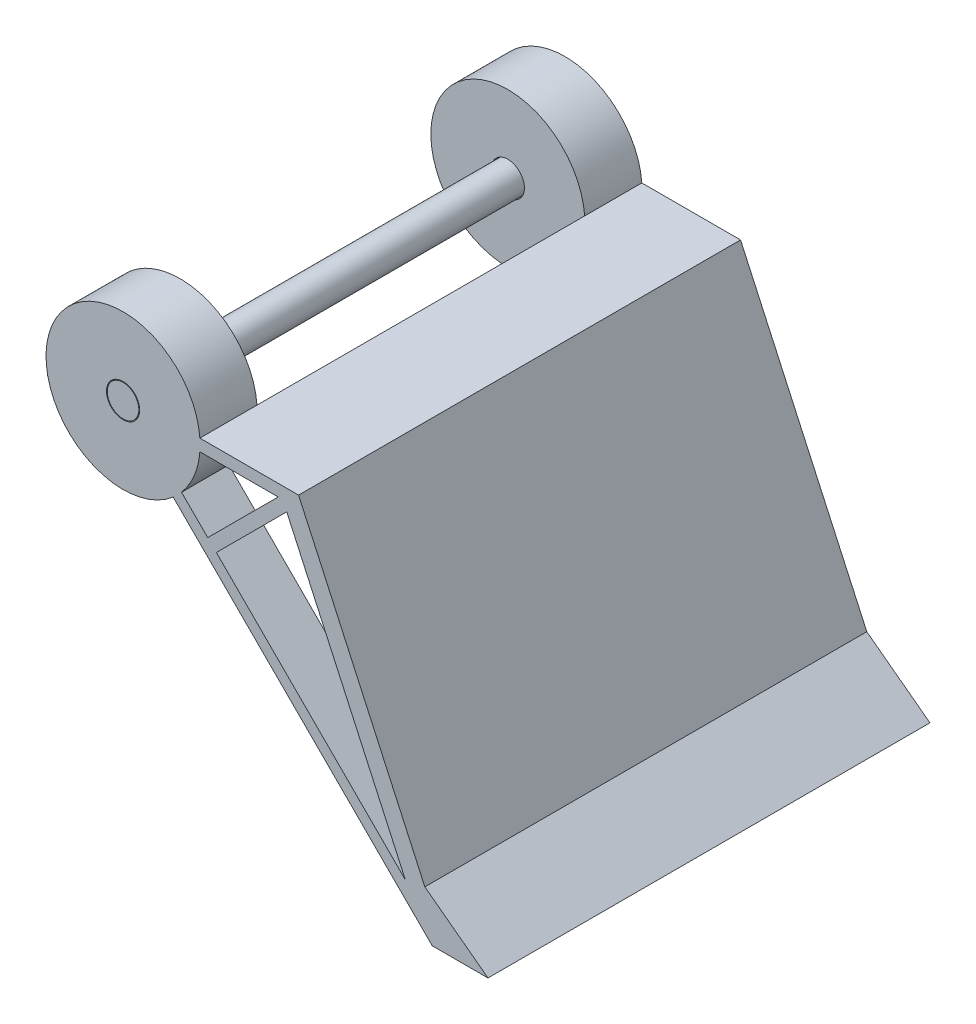
ISO-10303-21;
HEADER;
FILE_DESCRIPTION(('STEP AP214'),'2;1');
FILE_NAME('part.step','',(''),(''),'','','');
FILE_SCHEMA(('AUTOMOTIVE_DESIGN { 1 0 10303 214 1 1 1 1 }'));
ENDSEC;
DATA;
#1=APPLICATION_CONTEXT('core data for automotive mechanical design processes');
#2=APPLICATION_PROTOCOL_DEFINITION('international standard','automotive_design',2000,#1);
#3=PRODUCT_CONTEXT('',#1,'mechanical');
#4=PRODUCT('Part','Part','',(#3));
#5=PRODUCT_RELATED_PRODUCT_CATEGORY('part','',(#4));
#6=PRODUCT_DEFINITION_FORMATION('','',#4);
#7=PRODUCT_DEFINITION_CONTEXT('part definition',#1,'design');
#8=PRODUCT_DEFINITION('design','',#6,#7);
#9=PRODUCT_DEFINITION_SHAPE('','',#8);
#10=(LENGTH_UNIT() NAMED_UNIT(*) SI_UNIT(.MILLI.,.METRE.));
#11=(NAMED_UNIT(*) PLANE_ANGLE_UNIT() SI_UNIT($,.RADIAN.));
#12=(NAMED_UNIT(*) SI_UNIT($,.STERADIAN.) SOLID_ANGLE_UNIT());
#13=UNCERTAINTY_MEASURE_WITH_UNIT(LENGTH_MEASURE(1.E-05),#10,'distance_accuracy_value','');
#14=(GEOMETRIC_REPRESENTATION_CONTEXT(3) GLOBAL_UNCERTAINTY_ASSIGNED_CONTEXT((#13)) GLOBAL_UNIT_ASSIGNED_CONTEXT((#10,
#11,#12)) REPRESENTATION_CONTEXT('',''));
#15=CARTESIAN_POINT('',(0.,0.,0.));
#16=DIRECTION('',(0.,0.,1.));
#17=DIRECTION('',(1.,0.,0.));
#18=AXIS2_PLACEMENT_3D('',#15,#16,#17);
#19=CARTESIAN_POINT('',(0.,0.,0.));
#20=DIRECTION('',(0.,0.,1.));
#21=DIRECTION('',(1.,0.,0.));
#22=AXIS2_PLACEMENT_3D('',#19,#20,#21);
#23=CYLINDRICAL_SURFACE('',#22,12.7);
#24=CARTESIAN_POINT('',(0.,0.,0.));
#25=DIRECTION('',(0.,0.,-1.));
#26=DIRECTION('',(-1.,0.,0.));
#27=AXIS2_PLACEMENT_3D('',#24,#25,#26);
#28=CIRCLE('',#27,12.7);
#29=CARTESIAN_POINT('',(-12.7,0.,0.));
#30=VERTEX_POINT('',#29);
#31=EDGE_CURVE('E11',#30,#30,#28,.T.);
#32=ORIENTED_EDGE('',*,*,#31,.F.);
#33=EDGE_LOOP('',(#32));
#34=FACE_BOUND('',#33,.T.);
#35=CARTESIAN_POINT('',(0.,0.,355.6));
#36=DIRECTION('',(0.,0.,-1.));
#37=DIRECTION('',(-1.,0.,0.));
#38=AXIS2_PLACEMENT_3D('',#35,#36,#37);
#39=CIRCLE('',#38,12.7);
#40=CARTESIAN_POINT('',(-12.7,0.,355.6));
#41=VERTEX_POINT('',#40);
#42=EDGE_CURVE('E54',#41,#41,#39,.T.);
#43=ORIENTED_EDGE('',*,*,#42,.T.);
#44=EDGE_LOOP('',(#43));
#45=FACE_BOUND('',#44,.T.);
#46=ADVANCED_FACE('F51',(#34,#45),#23,.T.);
#47=CARTESIAN_POINT('',(0.,0.,0.));
#48=DIRECTION('',(0.,0.,-1.));
#49=DIRECTION('',(-1.,0.,0.));
#50=AXIS2_PLACEMENT_3D('',#47,#48,#49);
#51=PLANE('',#50);
#52=ORIENTED_EDGE('',*,*,#31,.T.);
#53=EDGE_LOOP('',(#52));
#54=FACE_BOUND('',#53,.T.);
#55=ADVANCED_FACE('F66',(#54),#51,.T.);
#56=CARTESIAN_POINT('',(0.,0.,355.6));
#57=DIRECTION('',(0.,0.,-1.));
#58=DIRECTION('',(-1.,0.,0.));
#59=AXIS2_PLACEMENT_3D('',#56,#57,#58);
#60=PLANE('',#59);
#61=ORIENTED_EDGE('',*,*,#42,.F.);
#62=EDGE_LOOP('',(#61));
#63=FACE_BOUND('',#62,.T.);
#64=ADVANCED_FACE('F64',(#63),#60,.F.);
#65=CLOSED_SHELL('',(#46,#55,#64));
#66=MANIFOLD_SOLID_BREP('B2',#65);
#67=CARTESIAN_POINT('',(40.3264720288239,-47.0616641196259,355.6));
#68=DIRECTION('',(0.707106781186547,0.707106781186547,0.));
#69=DIRECTION('',(-0.707106781186548,0.707106781186548,0.));
#70=AXIS2_PLACEMENT_3D('',#67,#68,#69);
#71=PLANE('',#70);
#72=DIRECTION('',(-0.707106781186548,0.707106781186548,0.));
#73=VECTOR('',#72,1.);
#74=CARTESIAN_POINT('',(40.3264720288239,-47.0616641196259,317.5));
#75=LINE('',#74,#73);
#76=CARTESIAN_POINT('',(248.788807909198,-255.524,317.5));
#77=VERTEX_POINT('',#76);
#78=CARTESIAN_POINT('',(40.3264720288239,-47.0616641196259,317.5));
#79=VERTEX_POINT('',#78);
#80=EDGE_CURVE('E260',#77,#79,#75,.T.);
#81=ORIENTED_EDGE('',*,*,#80,.F.);
#82=DIRECTION('',(0.,0.,-1.));
#83=VECTOR('',#82,1.);
#84=CARTESIAN_POINT('',(248.788807909198,-255.524,355.6));
#85=LINE('',#84,#83);
#86=CARTESIAN_POINT('',(248.788807909198,-255.524,355.6));
#87=VERTEX_POINT('',#86);
#88=EDGE_CURVE('E288',#87,#77,#85,.T.);
#89=ORIENTED_EDGE('',*,*,#88,.F.);
#90=DIRECTION('',(0.707106781186548,-0.707106781186547,0.));
#91=VECTOR('',#90,1.);
#92=CARTESIAN_POINT('',(40.3264720288239,-47.0616641196259,355.6));
#93=LINE('',#92,#91);
#94=CARTESIAN_POINT('',(40.3264720288239,-47.0616641196259,355.6));
#95=VERTEX_POINT('',#94);
#96=EDGE_CURVE('E286',#95,#87,#93,.T.);
#97=ORIENTED_EDGE('',*,*,#96,.F.);
#98=DIRECTION('',(0.,0.,-1.));
#99=VECTOR('',#98,1.);
#100=CARTESIAN_POINT('',(40.3264720288239,-47.0616641196259,355.6));
#101=LINE('',#100,#99);
#102=EDGE_CURVE('E49',#95,#79,#101,.T.);
#103=ORIENTED_EDGE('',*,*,#102,.T.);
#104=EDGE_LOOP('',(#81,#89,#97,#103));
#105=FACE_BOUND('',#104,.T.);
#106=ADVANCED_FACE('F98',(#105),#71,.F.);
#107=CARTESIAN_POINT('',(75.0520862114414,-68.3168941206397,355.6));
#108=DIRECTION('',(0.707106781186547,0.707106781186548,0.));
#109=DIRECTION('',(-0.707106781186548,0.707106781186547,0.));
#110=AXIS2_PLACEMENT_3D('',#107,#108,#109);
#111=PLANE('',#110);
#112=DIRECTION('',(0.,0.,-1.));
#113=VECTOR('',#112,1.);
#114=CARTESIAN_POINT('',(227.154568258756,-220.419376167954,355.6));
#115=LINE('',#114,#113);
#116=CARTESIAN_POINT('',(227.154568258756,-220.419376167954,355.6));
#117=VERTEX_POINT('',#116);
#118=CARTESIAN_POINT('',(227.154568258756,-220.419376167954,317.5));
#119=VERTEX_POINT('',#118);
#120=EDGE_CURVE('E309',#117,#119,#115,.T.);
#121=ORIENTED_EDGE('',*,*,#120,.T.);
#122=DIRECTION('',(-0.707106781186548,0.707106781186547,0.));
#123=VECTOR('',#122,1.);
#124=CARTESIAN_POINT('',(75.0520862114414,-68.3168941206397,317.5));
#125=LINE('',#124,#123);
#126=CARTESIAN_POINT('',(75.0520862114414,-68.3168941206397,317.5));
#127=VERTEX_POINT('',#126);
#128=EDGE_CURVE('E272',#119,#127,#125,.T.);
#129=ORIENTED_EDGE('',*,*,#128,.T.);
#130=DIRECTION('',(0.,0.,-1.));
#131=VECTOR('',#130,1.);
#132=CARTESIAN_POINT('',(75.0520862114414,-68.3168941206397,355.6));
#133=LINE('',#132,#131);
#134=CARTESIAN_POINT('',(75.0520862114414,-68.3168941206397,355.6));
#135=VERTEX_POINT('',#134);
#136=EDGE_CURVE('E496',#135,#127,#133,.T.);
#137=ORIENTED_EDGE('',*,*,#136,.F.);
#138=DIRECTION('',(0.707106781186548,-0.707106781186547,0.));
#139=VECTOR('',#138,1.);
#140=CARTESIAN_POINT('',(75.0520862114414,-68.3168941206397,355.6));
#141=LINE('',#140,#139);
#142=EDGE_CURVE('E474',#135,#117,#141,.T.);
#143=ORIENTED_EDGE('',*,*,#142,.T.);
#144=EDGE_LOOP('',(#121,#129,#137,#143));
#145=FACE_BOUND('',#144,.T.);
#146=ADVANCED_FACE('F578',(#145),#111,.T.);
#147=CARTESIAN_POINT('',(227.154568258756,-220.419376167954,355.6));
#148=DIRECTION('',(-0.909429543006509,-0.415858036241902,0.));
#149=DIRECTION('',(0.415858036241902,-0.909429543006509,0.));
#150=AXIS2_PLACEMENT_3D('',#147,#148,#149);
#151=PLANE('',#150);
#152=DIRECTION('',(0.,0.,-1.));
#153=VECTOR('',#152,1.);
#154=CARTESIAN_POINT('',(131.698999999998,-11.6699803320833,355.6));
#155=LINE('',#154,#153);
#156=CARTESIAN_POINT('',(131.698999999998,-11.6699803320833,355.6));
#157=VERTEX_POINT('',#156);
#158=CARTESIAN_POINT('',(131.698999999998,-11.6699803320833,317.5));
#159=VERTEX_POINT('',#158);
#160=EDGE_CURVE('E500',#157,#159,#155,.T.);
#161=ORIENTED_EDGE('',*,*,#160,.T.);
#162=DIRECTION('',(0.415858036241902,-0.909429543006509,0.));
#163=VECTOR('',#162,1.);
#164=CARTESIAN_POINT('',(227.154568258756,-220.419376167954,317.5));
#165=LINE('',#164,#163);
#166=EDGE_CURVE('E122',#159,#119,#165,.T.);
#167=ORIENTED_EDGE('',*,*,#166,.T.);
#168=ORIENTED_EDGE('',*,*,#120,.F.);
#169=DIRECTION('',(-0.415858036241902,0.909429543006509,0.));
#170=VECTOR('',#169,1.);
#171=CARTESIAN_POINT('',(227.154568258756,-220.419376167954,355.6));
#172=LINE('',#171,#170);
#173=EDGE_CURVE('E477',#117,#157,#172,.T.);
#174=ORIENTED_EDGE('',*,*,#173,.T.);
#175=EDGE_LOOP('',(#161,#167,#168,#174));
#176=FACE_BOUND('',#175,.T.);
#177=ADVANCED_FACE('F582',(#176),#151,.T.);
#178=CARTESIAN_POINT('',(75.0520862114414,-68.3168941206397,355.6));
#179=DIRECTION('',(0.707106781186547,-0.707106781186548,0.));
#180=DIRECTION('',(0.707106781186548,0.707106781186547,0.));
#181=AXIS2_PLACEMENT_3D('',#178,#179,#180);
#182=PLANE('',#181);
#183=ORIENTED_EDGE('',*,*,#136,.T.);
#184=DIRECTION('',(0.707106781186548,0.707106781186547,0.));
#185=VECTOR('',#184,1.);
#186=CARTESIAN_POINT('',(75.0520862114414,-68.3168941206397,317.5));
#187=LINE('',#186,#185);
#188=EDGE_CURVE('E539',#127,#159,#187,.T.);
#189=ORIENTED_EDGE('',*,*,#188,.T.);
#190=ORIENTED_EDGE('',*,*,#160,.F.);
#191=DIRECTION('',(-0.707106781186548,-0.707106781186547,0.));
#192=VECTOR('',#191,1.);
#193=CARTESIAN_POINT('',(75.0520862114414,-68.3168941206397,355.6));
#194=LINE('',#193,#192);
#195=EDGE_CURVE('E482',#157,#135,#194,.T.);
#196=ORIENTED_EDGE('',*,*,#195,.T.);
#197=EDGE_LOOP('',(#183,#189,#190,#196));
#198=FACE_BOUND('',#197,.T.);
#199=ADVANCED_FACE('F606',(#198),#182,.T.);
#200=CARTESIAN_POINT('',(47.0616641196258,-40.326472028824,355.6));
#201=DIRECTION('',(0.707106781186548,0.707106781186547,0.));
#202=DIRECTION('',(-0.707106781186547,0.707106781186548,0.));
#203=AXIS2_PLACEMENT_3D('',#200,#201,#202);
#204=PLANE('',#203);
#205=DIRECTION('',(0.,0.,-1.));
#206=VECTOR('',#205,1.);
#207=CARTESIAN_POINT('',(68.1446058793603,-61.4094137885586,355.6));
#208=LINE('',#207,#206);
#209=CARTESIAN_POINT('',(68.1446058793603,-61.4094137885586,355.6));
#210=VERTEX_POINT('',#209);
#211=CARTESIAN_POINT('',(68.1446058793603,-61.4094137885586,317.5));
#212=VERTEX_POINT('',#211);
#213=EDGE_CURVE('E458',#210,#212,#208,.T.);
#214=ORIENTED_EDGE('',*,*,#213,.T.);
#215=DIRECTION('',(-0.707106781186547,0.707106781186548,0.));
#216=VECTOR('',#215,1.);
#217=CARTESIAN_POINT('',(47.0616641196258,-40.326472028824,317.5));
#218=LINE('',#217,#216);
#219=CARTESIAN_POINT('',(47.0616641196258,-40.326472028824,317.5));
#220=VERTEX_POINT('',#219);
#221=EDGE_CURVE('E536',#212,#220,#218,.T.);
#222=ORIENTED_EDGE('',*,*,#221,.T.);
#223=DIRECTION('',(0.,0.,-1.));
#224=VECTOR('',#223,1.);
#225=CARTESIAN_POINT('',(47.0616641196258,-40.326472028824,355.6));
#226=LINE('',#225,#224);
#227=CARTESIAN_POINT('',(47.0616641196258,-40.326472028824,355.6));
#228=VERTEX_POINT('',#227);
#229=EDGE_CURVE('E281',#228,#220,#226,.T.);
#230=ORIENTED_EDGE('',*,*,#229,.F.);
#231=DIRECTION('',(0.707106781186547,-0.707106781186548,0.));
#232=VECTOR('',#231,1.);
#233=CARTESIAN_POINT('',(47.0616641196258,-40.326472028824,355.6));
#234=LINE('',#233,#232);
#235=EDGE_CURVE('E426',#228,#210,#234,.T.);
#236=ORIENTED_EDGE('',*,*,#235,.T.);
#237=EDGE_LOOP('',(#214,#222,#230,#236));
#238=FACE_BOUND('',#237,.T.);
#239=ADVANCED_FACE('F614',(#238),#204,.T.);
#240=CARTESIAN_POINT('',(124.791519667919,-4.7625,355.6));
#241=DIRECTION('',(-0.707106781186547,0.707106781186547,0.));
#242=DIRECTION('',(-0.707106781186548,-0.707106781186548,0.));
#243=AXIS2_PLACEMENT_3D('',#240,#241,#242);
#244=PLANE('',#243);
#245=DIRECTION('',(0.,0.,-1.));
#246=VECTOR('',#245,1.);
#247=CARTESIAN_POINT('',(124.791519667919,-4.7625,355.6));
#248=LINE('',#247,#246);
#249=CARTESIAN_POINT('',(124.791519667919,-4.7625,355.6));
#250=VERTEX_POINT('',#249);
#251=CARTESIAN_POINT('',(124.791519667919,-4.7625,317.5));
#252=VERTEX_POINT('',#251);
#253=EDGE_CURVE('E453',#250,#252,#248,.T.);
#254=ORIENTED_EDGE('',*,*,#253,.T.);
#255=DIRECTION('',(-0.707106781186548,-0.707106781186548,0.));
#256=VECTOR('',#255,1.);
#257=CARTESIAN_POINT('',(124.791519667919,-4.7625,317.5));
#258=LINE('',#257,#256);
#259=EDGE_CURVE('E527',#252,#212,#258,.T.);
#260=ORIENTED_EDGE('',*,*,#259,.T.);
#261=ORIENTED_EDGE('',*,*,#213,.F.);
#262=DIRECTION('',(0.707106781186547,0.707106781186547,0.));
#263=VECTOR('',#262,1.);
#264=CARTESIAN_POINT('',(124.791519667919,-4.7625,355.6));
#265=LINE('',#264,#263);
#266=EDGE_CURVE('E430',#210,#250,#265,.T.);
#267=ORIENTED_EDGE('',*,*,#266,.T.);
#268=EDGE_LOOP('',(#254,#260,#261,#267));
#269=FACE_BOUND('',#268,.T.);
#270=ADVANCED_FACE('F619',(#269),#244,.T.);
#271=CARTESIAN_POINT('',(0.,0.,355.6));
#272=DIRECTION('',(0.,0.,-1.));
#273=DIRECTION('',(-1.,0.,0.));
#274=AXIS2_PLACEMENT_3D('',#271,#272,#273);
#275=CYLINDRICAL_SURFACE('',#274,13.335);
#276=CARTESIAN_POINT('',(0.,0.,355.6));
#277=DIRECTION('',(0.,0.,1.));
#278=DIRECTION('',(1.,0.,0.));
#279=AXIS2_PLACEMENT_3D('',#276,#277,#278);
#280=CIRCLE('',#279,13.335);
#281=CARTESIAN_POINT('',(13.335,0.,355.6));
#282=VERTEX_POINT('',#281);
#283=EDGE_CURVE('E466',#282,#282,#280,.T.);
#284=ORIENTED_EDGE('',*,*,#283,.T.);
#285=EDGE_LOOP('',(#284));
#286=FACE_BOUND('',#285,.T.);
#287=CARTESIAN_POINT('',(0.,0.,309.626));
#288=DIRECTION('',(0.,0.,-1.));
#289=DIRECTION('',(-1.,0.,0.));
#290=AXIS2_PLACEMENT_3D('',#287,#288,#289);
#291=CIRCLE('',#290,13.335);
#292=CARTESIAN_POINT('',(-13.335,0.,309.626));
#293=VERTEX_POINT('',#292);
#294=EDGE_CURVE('E546',#293,#293,#291,.T.);
#295=ORIENTED_EDGE('',*,*,#294,.T.);
#296=EDGE_LOOP('',(#295));
#297=FACE_BOUND('',#296,.T.);
#298=ADVANCED_FACE('F564',(#286,#297),#275,.F.);
#299=CARTESIAN_POINT('',(0.,0.,355.6));
#300=DIRECTION('',(0.,0.,-1.));
#301=DIRECTION('',(-1.,0.,0.));
#302=AXIS2_PLACEMENT_3D('',#299,#300,#301);
#303=CYLINDRICAL_SURFACE('',#302,61.976);
#304=CARTESIAN_POINT('',(0.,0.,309.626));
#305=DIRECTION('',(0.,0.,-1.));
#306=DIRECTION('',(-1.,0.,0.));
#307=AXIS2_PLACEMENT_3D('',#304,#305,#306);
#308=CIRCLE('',#307,61.976);
#309=CARTESIAN_POINT('',(61.7927436658221,-4.7625,309.626));
#310=VERTEX_POINT('',#309);
#311=CARTESIAN_POINT('',(61.7927436658221,4.7625,309.626));
#312=VERTEX_POINT('',#311);
#313=EDGE_CURVE('E391',#310,#312,#308,.T.);
#314=ORIENTED_EDGE('',*,*,#313,.F.);
#315=DIRECTION('',(0.,0.,-1.));
#316=VECTOR('',#315,1.);
#317=CARTESIAN_POINT('',(61.7927436658221,-4.7625,355.6));
#318=LINE('',#317,#316);
#319=CARTESIAN_POINT('',(61.7927436658221,-4.7625,355.6));
#320=VERTEX_POINT('',#319);
#321=EDGE_CURVE('E393',#320,#310,#318,.T.);
#322=ORIENTED_EDGE('',*,*,#321,.F.);
#323=CARTESIAN_POINT('',(0.,0.,355.6));
#324=DIRECTION('',(0.,0.,-1.));
#325=DIRECTION('',(-1.,0.,0.));
#326=AXIS2_PLACEMENT_3D('',#323,#324,#325);
#327=CIRCLE('',#326,61.976);
#328=EDGE_CURVE('E423',#320,#228,#327,.T.);
#329=ORIENTED_EDGE('',*,*,#328,.T.);
#330=ORIENTED_EDGE('',*,*,#229,.T.);
#331=CARTESIAN_POINT('',(0.,0.,317.5));
#332=DIRECTION('',(0.,0.,1.));
#333=DIRECTION('',(-1.,0.,0.));
#334=AXIS2_PLACEMENT_3D('',#331,#332,#333);
#335=CIRCLE('',#334,61.976);
#336=EDGE_CURVE('E263',#79,#220,#335,.T.);
#337=ORIENTED_EDGE('',*,*,#336,.F.);
#338=ORIENTED_EDGE('',*,*,#102,.F.);
#339=CARTESIAN_POINT('',(0.,0.,355.6));
#340=DIRECTION('',(0.,0.,1.));
#341=DIRECTION('',(1.,0.,0.));
#342=AXIS2_PLACEMENT_3D('',#339,#340,#341);
#343=CIRCLE('',#342,61.976);
#344=CARTESIAN_POINT('',(61.7927436658221,4.7625,355.6));
#345=VERTEX_POINT('',#344);
#346=EDGE_CURVE('E293',#345,#95,#343,.T.);
#347=ORIENTED_EDGE('',*,*,#346,.F.);
#348=DIRECTION('',(0.,0.,-1.));
#349=VECTOR('',#348,1.);
#350=CARTESIAN_POINT('',(61.7927436658221,4.7625,355.6));
#351=LINE('',#350,#349);
#352=EDGE_CURVE('E339',#345,#312,#351,.T.);
#353=ORIENTED_EDGE('',*,*,#352,.T.);
#354=EDGE_LOOP('',(#314,#322,#329,#330,#337,#338,#347,#353));
#355=FACE_BOUND('',#354,.T.);
#356=ADVANCED_FACE('F278',(#355),#303,.T.);
#357=CARTESIAN_POINT('',(0.,0.,355.6));
#358=DIRECTION('',(0.,0.,1.));
#359=DIRECTION('',(1.,0.,0.));
#360=AXIS2_PLACEMENT_3D('',#357,#358,#359);
#361=PLANE('',#360);
#362=ORIENTED_EDGE('',*,*,#173,.F.);
#363=ORIENTED_EDGE('',*,*,#142,.F.);
#364=ORIENTED_EDGE('',*,*,#195,.F.);
#365=EDGE_LOOP('',(#362,#363,#364));
#366=FACE_BOUND('',#365,.T.);
#367=ORIENTED_EDGE('',*,*,#346,.T.);
#368=ORIENTED_EDGE('',*,*,#96,.T.);
#369=DIRECTION('',(1.,0.,0.));
#370=VECTOR('',#369,1.);
#371=CARTESIAN_POINT('',(293.624,-255.524,355.6));
#372=LINE('',#371,#370);
#373=CARTESIAN_POINT('',(293.624,-255.524,355.6));
#374=VERTEX_POINT('',#373);
#375=EDGE_CURVE('E292',#87,#374,#372,.T.);
#376=ORIENTED_EDGE('',*,*,#375,.T.);
#377=DIRECTION('',(-0.799999999999999,0.600000000000001,0.));
#378=VECTOR('',#377,1.);
#379=CARTESIAN_POINT('',(242.824,-217.424,355.6));
#380=LINE('',#379,#378);
#381=CARTESIAN_POINT('',(242.824,-217.424,355.6));
#382=VERTEX_POINT('',#381);
#383=EDGE_CURVE('E314',#374,#382,#380,.T.);
#384=ORIENTED_EDGE('',*,*,#383,.T.);
#385=DIRECTION('',(-0.415858036241902,0.909429543006509,0.));
#386=VECTOR('',#385,1.);
#387=CARTESIAN_POINT('',(141.224,4.7625,355.6));
#388=LINE('',#387,#386);
#389=CARTESIAN_POINT('',(141.224,4.7625,355.6));
#390=VERTEX_POINT('',#389);
#391=EDGE_CURVE('E317',#382,#390,#388,.T.);
#392=ORIENTED_EDGE('',*,*,#391,.T.);
#393=DIRECTION('',(-1.,0.,0.));
#394=VECTOR('',#393,1.);
#395=CARTESIAN_POINT('',(61.7927436658221,4.7625,355.6));
#396=LINE('',#395,#394);
#397=EDGE_CURVE('E298',#390,#345,#396,.T.);
#398=ORIENTED_EDGE('',*,*,#397,.T.);
#399=EDGE_LOOP('',(#367,#368,#376,#384,#392,#398));
#400=FACE_BOUND('',#399,.T.);
#401=ORIENTED_EDGE('',*,*,#283,.F.);
#402=EDGE_LOOP('',(#401));
#403=FACE_BOUND('',#402,.T.);
#404=ORIENTED_EDGE('',*,*,#235,.F.);
#405=ORIENTED_EDGE('',*,*,#328,.F.);
#406=DIRECTION('',(-1.,0.,0.));
#407=VECTOR('',#406,1.);
#408=CARTESIAN_POINT('',(61.7927436658221,-4.7625,355.6));
#409=LINE('',#408,#407);
#410=EDGE_CURVE('E434',#250,#320,#409,.T.);
#411=ORIENTED_EDGE('',*,*,#410,.F.);
#412=ORIENTED_EDGE('',*,*,#266,.F.);
#413=EDGE_LOOP('',(#404,#405,#411,#412));
#414=FACE_BOUND('',#413,.T.);
#415=ADVANCED_FACE('F295',(#366,#400,#403,#414),#361,.T.);
#416=CARTESIAN_POINT('',(0.,0.,0.));
#417=DIRECTION('',(0.,0.,1.));
#418=DIRECTION('',(1.,0.,0.));
#419=AXIS2_PLACEMENT_3D('',#416,#417,#418);
#420=PLANE('',#419);
#421=CARTESIAN_POINT('',(0.,0.,0.));
#422=DIRECTION('',(0.,0.,1.));
#423=DIRECTION('',(1.,0.,0.));
#424=AXIS2_PLACEMENT_3D('',#421,#422,#423);
#425=CIRCLE('',#424,13.335);
#426=CARTESIAN_POINT('',(13.335,0.,0.));
#427=VERTEX_POINT('',#426);
#428=EDGE_CURVE('E465',#427,#427,#425,.T.);
#429=ORIENTED_EDGE('',*,*,#428,.T.);
#430=EDGE_LOOP('',(#429));
#431=FACE_BOUND('',#430,.T.);
#432=DIRECTION('',(0.707106781186548,-0.707106781186547,0.));
#433=VECTOR('',#432,1.);
#434=CARTESIAN_POINT('',(75.0520862114414,-68.3168941206397,0.));
#435=LINE('',#434,#433);
#436=CARTESIAN_POINT('',(75.0520862114414,-68.3168941206397,0.));
#437=VERTEX_POINT('',#436);
#438=CARTESIAN_POINT('',(227.154568258756,-220.419376167954,0.));
#439=VERTEX_POINT('',#438);
#440=EDGE_CURVE('E470',#437,#439,#435,.T.);
#441=ORIENTED_EDGE('',*,*,#440,.T.);
#442=DIRECTION('',(-0.415858036241902,0.909429543006509,0.));
#443=VECTOR('',#442,1.);
#444=CARTESIAN_POINT('',(227.154568258756,-220.419376167954,0.));
#445=LINE('',#444,#443);
#446=CARTESIAN_POINT('',(131.698999999998,-11.6699803320833,0.));
#447=VERTEX_POINT('',#446);
#448=EDGE_CURVE('E489',#439,#447,#445,.T.);
#449=ORIENTED_EDGE('',*,*,#448,.T.);
#450=DIRECTION('',(-0.707106781186548,-0.707106781186547,0.));
#451=VECTOR('',#450,1.);
#452=CARTESIAN_POINT('',(75.0520862114414,-68.3168941206397,0.));
#453=LINE('',#452,#451);
#454=EDGE_CURVE('E478',#447,#437,#453,.T.);
#455=ORIENTED_EDGE('',*,*,#454,.T.);
#456=EDGE_LOOP('',(#441,#449,#455));
#457=FACE_BOUND('',#456,.T.);
#458=CARTESIAN_POINT('',(0.,0.,0.));
#459=DIRECTION('',(0.,0.,1.));
#460=DIRECTION('',(1.,0.,0.));
#461=AXIS2_PLACEMENT_3D('',#458,#459,#460);
#462=CIRCLE('',#461,61.976);
#463=CARTESIAN_POINT('',(61.7927436658221,4.7625,0.));
#464=VERTEX_POINT('',#463);
#465=CARTESIAN_POINT('',(40.3264720288239,-47.0616641196259,0.));
#466=VERTEX_POINT('',#465);
#467=EDGE_CURVE('E323',#464,#466,#462,.T.);
#468=ORIENTED_EDGE('',*,*,#467,.F.);
#469=DIRECTION('',(-1.,0.,0.));
#470=VECTOR('',#469,1.);
#471=CARTESIAN_POINT('',(61.7927436658221,4.7625,0.));
#472=LINE('',#471,#470);
#473=CARTESIAN_POINT('',(141.224,4.7625,0.));
#474=VERTEX_POINT('',#473);
#475=EDGE_CURVE('E302',#474,#464,#472,.T.);
#476=ORIENTED_EDGE('',*,*,#475,.F.);
#477=DIRECTION('',(-0.415858036241902,0.909429543006509,0.));
#478=VECTOR('',#477,1.);
#479=CARTESIAN_POINT('',(141.224,4.7625,0.));
#480=LINE('',#479,#478);
#481=CARTESIAN_POINT('',(242.824,-217.424,0.));
#482=VERTEX_POINT('',#481);
#483=EDGE_CURVE('E306',#482,#474,#480,.T.);
#484=ORIENTED_EDGE('',*,*,#483,.F.);
#485=DIRECTION('',(-0.799999999999999,0.600000000000001,0.));
#486=VECTOR('',#485,1.);
#487=CARTESIAN_POINT('',(242.824,-217.424,0.));
#488=LINE('',#487,#486);
#489=CARTESIAN_POINT('',(293.624,-255.524,0.));
#490=VERTEX_POINT('',#489);
#491=EDGE_CURVE('E334',#490,#482,#488,.T.);
#492=ORIENTED_EDGE('',*,*,#491,.F.);
#493=DIRECTION('',(1.,0.,0.));
#494=VECTOR('',#493,1.);
#495=CARTESIAN_POINT('',(293.624,-255.524,0.));
#496=LINE('',#495,#494);
#497=CARTESIAN_POINT('',(248.788807909198,-255.524,0.));
#498=VERTEX_POINT('',#497);
#499=EDGE_CURVE('E331',#498,#490,#496,.T.);
#500=ORIENTED_EDGE('',*,*,#499,.F.);
#501=DIRECTION('',(0.707106781186548,-0.707106781186547,0.));
#502=VECTOR('',#501,1.);
#503=CARTESIAN_POINT('',(40.3264720288239,-47.0616641196259,0.));
#504=LINE('',#503,#502);
#505=EDGE_CURVE('E327',#466,#498,#504,.T.);
#506=ORIENTED_EDGE('',*,*,#505,.F.);
#507=EDGE_LOOP('',(#468,#476,#484,#492,#500,#506));
#508=FACE_BOUND('',#507,.T.);
#509=CARTESIAN_POINT('',(0.,0.,0.));
#510=DIRECTION('',(0.,0.,-1.));
#511=DIRECTION('',(-1.,0.,0.));
#512=AXIS2_PLACEMENT_3D('',#509,#510,#511);
#513=CIRCLE('',#512,61.976);
#514=CARTESIAN_POINT('',(61.7927436658221,-4.7625,0.));
#515=VERTEX_POINT('',#514);
#516=CARTESIAN_POINT('',(47.0616641196258,-40.326472028824,0.));
#517=VERTEX_POINT('',#516);
#518=EDGE_CURVE('E415',#515,#517,#513,.T.);
#519=ORIENTED_EDGE('',*,*,#518,.T.);
#520=DIRECTION('',(0.707106781186547,-0.707106781186548,0.));
#521=VECTOR('',#520,1.);
#522=CARTESIAN_POINT('',(47.0616641196258,-40.326472028824,0.));
#523=LINE('',#522,#521);
#524=CARTESIAN_POINT('',(68.1446058793603,-61.4094137885586,0.));
#525=VERTEX_POINT('',#524);
#526=EDGE_CURVE('E440',#517,#525,#523,.T.);
#527=ORIENTED_EDGE('',*,*,#526,.T.);
#528=DIRECTION('',(0.707106781186547,0.707106781186547,0.));
#529=VECTOR('',#528,1.);
#530=CARTESIAN_POINT('',(124.791519667919,-4.7625,0.));
#531=LINE('',#530,#529);
#532=CARTESIAN_POINT('',(124.791519667919,-4.7625,0.));
#533=VERTEX_POINT('',#532);
#534=EDGE_CURVE('E444',#525,#533,#531,.T.);
#535=ORIENTED_EDGE('',*,*,#534,.T.);
#536=DIRECTION('',(-1.,0.,0.));
#537=VECTOR('',#536,1.);
#538=CARTESIAN_POINT('',(61.7927436658221,-4.7625,0.));
#539=LINE('',#538,#537);
#540=EDGE_CURVE('E427',#533,#515,#539,.T.);
#541=ORIENTED_EDGE('',*,*,#540,.T.);
#542=EDGE_LOOP('',(#519,#527,#535,#541));
#543=FACE_BOUND('',#542,.T.);
#544=ADVANCED_FACE('F372',(#431,#457,#508,#543),#420,.F.);
#545=CARTESIAN_POINT('',(0.,0.,355.6));
#546=DIRECTION('',(0.,0.,-1.));
#547=DIRECTION('',(-1.,0.,0.));
#548=AXIS2_PLACEMENT_3D('',#545,#546,#547);
#549=CYLINDRICAL_SURFACE('',#548,61.976);
#550=CARTESIAN_POINT('',(40.3264720288239,-47.0616641196259,38.1));
#551=VERTEX_POINT('',#550);
#552=EDGE_CURVE('E107',#551,#466,#101,.T.);
#553=ORIENTED_EDGE('',*,*,#552,.F.);
#554=CARTESIAN_POINT('',(0.,0.,38.1));
#555=DIRECTION('',(0.,0.,1.));
#556=DIRECTION('',(-1.,0.,0.));
#557=AXIS2_PLACEMENT_3D('',#554,#555,#556);
#558=CIRCLE('',#557,61.976);
#559=CARTESIAN_POINT('',(47.0616641196258,-40.326472028824,38.1));
#560=VERTEX_POINT('',#559);
#561=EDGE_CURVE('E896',#551,#560,#558,.T.);
#562=ORIENTED_EDGE('',*,*,#561,.T.);
#563=EDGE_CURVE('E462',#560,#517,#226,.T.);
#564=ORIENTED_EDGE('',*,*,#563,.T.);
#565=ORIENTED_EDGE('',*,*,#518,.F.);
#566=CARTESIAN_POINT('',(61.7927436658221,-4.7625,45.974));
#567=VERTEX_POINT('',#566);
#568=EDGE_CURVE('E410',#567,#515,#318,.T.);
#569=ORIENTED_EDGE('',*,*,#568,.F.);
#570=CARTESIAN_POINT('',(0.,0.,45.974));
#571=DIRECTION('',(0.,0.,-1.));
#572=DIRECTION('',(-1.,0.,0.));
#573=AXIS2_PLACEMENT_3D('',#570,#571,#572);
#574=CIRCLE('',#573,61.976);
#575=CARTESIAN_POINT('',(61.7927436658221,4.7625,45.974));
#576=VERTEX_POINT('',#575);
#577=EDGE_CURVE('E421',#567,#576,#574,.T.);
#578=ORIENTED_EDGE('',*,*,#577,.T.);
#579=EDGE_CURVE('E322',#576,#464,#351,.T.);
#580=ORIENTED_EDGE('',*,*,#579,.T.);
#581=ORIENTED_EDGE('',*,*,#467,.T.);
#582=EDGE_LOOP('',(#553,#562,#564,#565,#569,#578,#580,#581));
#583=FACE_BOUND('',#582,.T.);
#584=ADVANCED_FACE('F100',(#583),#549,.T.);
#585=CARTESIAN_POINT('',(248.788807909198,-255.524,38.1));
#586=VERTEX_POINT('',#585);
#587=EDGE_CURVE('E353',#586,#498,#85,.T.);
#588=ORIENTED_EDGE('',*,*,#587,.F.);
#589=DIRECTION('',(-0.707106781186548,0.707106781186548,0.));
#590=VECTOR('',#589,1.);
#591=CARTESIAN_POINT('',(40.3264720288239,-47.0616641196259,38.1));
#592=LINE('',#591,#590);
#593=EDGE_CURVE('E523',#586,#551,#592,.T.);
#594=ORIENTED_EDGE('',*,*,#593,.T.);
#595=ORIENTED_EDGE('',*,*,#552,.T.);
#596=ORIENTED_EDGE('',*,*,#505,.T.);
#597=EDGE_LOOP('',(#588,#594,#595,#596));
#598=FACE_BOUND('',#597,.T.);
#599=ADVANCED_FACE('F367',(#598),#71,.F.);
#600=CARTESIAN_POINT('',(293.624,-255.524,355.6));
#601=DIRECTION('',(0.,1.,0.));
#602=DIRECTION('',(0.,0.,1.));
#603=AXIS2_PLACEMENT_3D('',#600,#601,#602);
#604=PLANE('',#603);
#605=ORIENTED_EDGE('',*,*,#499,.T.);
#606=DIRECTION('',(0.,0.,-1.));
#607=VECTOR('',#606,1.);
#608=CARTESIAN_POINT('',(293.624,-255.524,355.6));
#609=LINE('',#608,#607);
#610=EDGE_CURVE('E350',#374,#490,#609,.T.);
#611=ORIENTED_EDGE('',*,*,#610,.F.);
#612=ORIENTED_EDGE('',*,*,#375,.F.);
#613=ORIENTED_EDGE('',*,*,#88,.T.);
#614=DIRECTION('',(0.,0.,-1.));
#615=VECTOR('',#614,1.);
#616=CARTESIAN_POINT('',(248.788807909198,-255.524,317.5));
#617=LINE('',#616,#615);
#618=EDGE_CURVE('E363',#77,#586,#617,.T.);
#619=ORIENTED_EDGE('',*,*,#618,.T.);
#620=ORIENTED_EDGE('',*,*,#587,.T.);
#621=EDGE_LOOP('',(#605,#611,#612,#613,#619,#620));
#622=FACE_BOUND('',#621,.T.);
#623=ADVANCED_FACE('F360',(#622),#604,.F.);
#624=CARTESIAN_POINT('',(242.824,-217.424,355.6));
#625=DIRECTION('',(-0.600000000000001,-0.799999999999999,0.));
#626=DIRECTION('',(0.799999999999999,-0.600000000000001,0.));
#627=AXIS2_PLACEMENT_3D('',#624,#625,#626);
#628=PLANE('',#627);
#629=ORIENTED_EDGE('',*,*,#491,.T.);
#630=DIRECTION('',(0.,0.,-1.));
#631=VECTOR('',#630,1.);
#632=CARTESIAN_POINT('',(242.824,-217.424,355.6));
#633=LINE('',#632,#631);
#634=EDGE_CURVE('E346',#382,#482,#633,.T.);
#635=ORIENTED_EDGE('',*,*,#634,.F.);
#636=ORIENTED_EDGE('',*,*,#383,.F.);
#637=ORIENTED_EDGE('',*,*,#610,.T.);
#638=EDGE_LOOP('',(#629,#635,#636,#637));
#639=FACE_BOUND('',#638,.T.);
#640=ADVANCED_FACE('F378',(#639),#628,.F.);
#641=CARTESIAN_POINT('',(141.224,4.7625,355.6));
#642=DIRECTION('',(-0.909429543006509,-0.415858036241902,0.));
#643=DIRECTION('',(0.415858036241902,-0.909429543006509,0.));
#644=AXIS2_PLACEMENT_3D('',#641,#642,#643);
#645=PLANE('',#644);
#646=ORIENTED_EDGE('',*,*,#483,.T.);
#647=DIRECTION('',(0.,0.,-1.));
#648=VECTOR('',#647,1.);
#649=CARTESIAN_POINT('',(141.224,4.7625,355.6));
#650=LINE('',#649,#648);
#651=EDGE_CURVE('E342',#390,#474,#650,.T.);
#652=ORIENTED_EDGE('',*,*,#651,.F.);
#653=ORIENTED_EDGE('',*,*,#391,.F.);
#654=ORIENTED_EDGE('',*,*,#634,.T.);
#655=EDGE_LOOP('',(#646,#652,#653,#654));
#656=FACE_BOUND('',#655,.T.);
#657=ADVANCED_FACE('F382',(#656),#645,.F.);
#658=CARTESIAN_POINT('',(61.7927436658221,4.7625,355.6));
#659=DIRECTION('',(0.,-1.,0.));
#660=DIRECTION('',(1.,0.,0.));
#661=AXIS2_PLACEMENT_3D('',#658,#659,#660);
#662=PLANE('',#661);
#663=ORIENTED_EDGE('',*,*,#475,.T.);
#664=ORIENTED_EDGE('',*,*,#579,.F.);
#665=DIRECTION('',(0.,0.,-1.));
#666=VECTOR('',#665,1.);
#667=CARTESIAN_POINT('',(61.7927436658221,4.7625,309.626));
#668=LINE('',#667,#666);
#669=EDGE_CURVE('E389',#576,#312,#668,.F.);
#670=ORIENTED_EDGE('',*,*,#669,.T.);
#671=ORIENTED_EDGE('',*,*,#352,.F.);
#672=ORIENTED_EDGE('',*,*,#397,.F.);
#673=ORIENTED_EDGE('',*,*,#651,.T.);
#674=EDGE_LOOP('',(#663,#664,#670,#671,#672,#673));
#675=FACE_BOUND('',#674,.T.);
#676=ADVANCED_FACE('F385',(#675),#662,.F.);
#677=DIRECTION('',(-0.707106781186548,0.707106781186547,0.));
#678=VECTOR('',#677,1.);
#679=CARTESIAN_POINT('',(75.0520862114414,-68.3168941206397,38.1));
#680=LINE('',#679,#678);
#681=CARTESIAN_POINT('',(227.154568258756,-220.419376167954,38.1));
#682=VERTEX_POINT('',#681);
#683=CARTESIAN_POINT('',(75.0520862114414,-68.3168941206397,38.1));
#684=VERTEX_POINT('',#683);
#685=EDGE_CURVE('E114',#682,#684,#680,.T.);
#686=ORIENTED_EDGE('',*,*,#685,.F.);
#687=EDGE_CURVE('E503',#682,#439,#115,.T.);
#688=ORIENTED_EDGE('',*,*,#687,.T.);
#689=ORIENTED_EDGE('',*,*,#440,.F.);
#690=EDGE_CURVE('E485',#684,#437,#133,.T.);
#691=ORIENTED_EDGE('',*,*,#690,.F.);
#692=EDGE_LOOP('',(#686,#688,#689,#691));
#693=FACE_BOUND('',#692,.T.);
#694=ADVANCED_FACE('F521',(#693),#111,.T.);
#695=DIRECTION('',(0.415858036241902,-0.909429543006509,0.));
#696=VECTOR('',#695,1.);
#697=CARTESIAN_POINT('',(227.154568258756,-220.419376167954,38.1));
#698=LINE('',#697,#696);
#699=CARTESIAN_POINT('',(131.698999999998,-11.6699803320833,38.1));
#700=VERTEX_POINT('',#699);
#701=EDGE_CURVE('E514',#700,#682,#698,.T.);
#702=ORIENTED_EDGE('',*,*,#701,.F.);
#703=EDGE_CURVE('E499',#700,#447,#155,.T.);
#704=ORIENTED_EDGE('',*,*,#703,.T.);
#705=ORIENTED_EDGE('',*,*,#448,.F.);
#706=ORIENTED_EDGE('',*,*,#687,.F.);
#707=EDGE_LOOP('',(#702,#704,#705,#706));
#708=FACE_BOUND('',#707,.T.);
#709=ADVANCED_FACE('F512',(#708),#151,.T.);
#710=DIRECTION('',(0.707106781186548,0.707106781186547,0.));
#711=VECTOR('',#710,1.);
#712=CARTESIAN_POINT('',(75.0520862114414,-68.3168941206397,38.1));
#713=LINE('',#712,#711);
#714=EDGE_CURVE('E529',#684,#700,#713,.T.);
#715=ORIENTED_EDGE('',*,*,#714,.F.);
#716=ORIENTED_EDGE('',*,*,#690,.T.);
#717=ORIENTED_EDGE('',*,*,#454,.F.);
#718=ORIENTED_EDGE('',*,*,#703,.F.);
#719=EDGE_LOOP('',(#715,#716,#717,#718));
#720=FACE_BOUND('',#719,.T.);
#721=ADVANCED_FACE('F516',(#720),#182,.T.);
#722=CARTESIAN_POINT('',(0.,0.,45.974));
#723=DIRECTION('',(0.,0.,-1.));
#724=DIRECTION('',(-1.,0.,0.));
#725=AXIS2_PLACEMENT_3D('',#722,#723,#724);
#726=CIRCLE('',#725,13.335);
#727=CARTESIAN_POINT('',(-13.335,0.,45.974));
#728=VERTEX_POINT('',#727);
#729=EDGE_CURVE('E271',#728,#728,#726,.T.);
#730=ORIENTED_EDGE('',*,*,#729,.F.);
#731=EDGE_LOOP('',(#730));
#732=FACE_BOUND('',#731,.T.);
#733=ORIENTED_EDGE('',*,*,#428,.F.);
#734=EDGE_LOOP('',(#733));
#735=FACE_BOUND('',#734,.T.);
#736=ADVANCED_FACE('F559',(#732,#735),#275,.F.);
#737=DIRECTION('',(-0.707106781186547,0.707106781186548,0.));
#738=VECTOR('',#737,1.);
#739=CARTESIAN_POINT('',(47.0616641196258,-40.326472028824,38.1));
#740=LINE('',#739,#738);
#741=CARTESIAN_POINT('',(68.1446058793603,-61.4094137885586,38.1));
#742=VERTEX_POINT('',#741);
#743=EDGE_CURVE('E913',#742,#560,#740,.T.);
#744=ORIENTED_EDGE('',*,*,#743,.F.);
#745=EDGE_CURVE('E457',#742,#525,#208,.T.);
#746=ORIENTED_EDGE('',*,*,#745,.T.);
#747=ORIENTED_EDGE('',*,*,#526,.F.);
#748=ORIENTED_EDGE('',*,*,#563,.F.);
#749=EDGE_LOOP('',(#744,#746,#747,#748));
#750=FACE_BOUND('',#749,.T.);
#751=ADVANCED_FACE('F562',(#750),#204,.T.);
#752=DIRECTION('',(-0.707106781186548,-0.707106781186548,0.));
#753=VECTOR('',#752,1.);
#754=CARTESIAN_POINT('',(124.791519667919,-4.7625,38.1));
#755=LINE('',#754,#753);
#756=CARTESIAN_POINT('',(124.791519667919,-4.7625,38.1));
#757=VERTEX_POINT('',#756);
#758=EDGE_CURVE('E908',#757,#742,#755,.T.);
#759=ORIENTED_EDGE('',*,*,#758,.F.);
#760=EDGE_CURVE('E452',#757,#533,#248,.T.);
#761=ORIENTED_EDGE('',*,*,#760,.T.);
#762=ORIENTED_EDGE('',*,*,#534,.F.);
#763=ORIENTED_EDGE('',*,*,#745,.F.);
#764=EDGE_LOOP('',(#759,#761,#762,#763));
#765=FACE_BOUND('',#764,.T.);
#766=ADVANCED_FACE('F612',(#765),#244,.T.);
#767=CARTESIAN_POINT('',(61.7927436658221,-4.7625,355.6));
#768=DIRECTION('',(0.,-1.,0.));
#769=DIRECTION('',(1.,0.,0.));
#770=AXIS2_PLACEMENT_3D('',#767,#768,#769);
#771=PLANE('',#770);
#772=ORIENTED_EDGE('',*,*,#760,.F.);
#773=DIRECTION('',(1.,0.,0.));
#774=VECTOR('',#773,1.);
#775=CARTESIAN_POINT('',(134.122217454782,-4.7625,38.1));
#776=LINE('',#775,#774);
#777=CARTESIAN_POINT('',(134.122217454782,-4.7625,38.1));
#778=VERTEX_POINT('',#777);
#779=EDGE_CURVE('E900',#757,#778,#776,.T.);
#780=ORIENTED_EDGE('',*,*,#779,.T.);
#781=DIRECTION('',(0.,0.,-1.));
#782=VECTOR('',#781,1.);
#783=CARTESIAN_POINT('',(134.122217454782,-4.7625,317.5));
#784=LINE('',#783,#782);
#785=CARTESIAN_POINT('',(134.122217454782,-4.7625,317.5));
#786=VERTEX_POINT('',#785);
#787=EDGE_CURVE('E890',#786,#778,#784,.T.);
#788=ORIENTED_EDGE('',*,*,#787,.F.);
#789=DIRECTION('',(1.,0.,0.));
#790=VECTOR('',#789,1.);
#791=CARTESIAN_POINT('',(134.122217454782,-4.7625,317.5));
#792=LINE('',#791,#790);
#793=EDGE_CURVE('E283',#252,#786,#792,.T.);
#794=ORIENTED_EDGE('',*,*,#793,.F.);
#795=ORIENTED_EDGE('',*,*,#253,.F.);
#796=ORIENTED_EDGE('',*,*,#410,.T.);
#797=ORIENTED_EDGE('',*,*,#321,.T.);
#798=EDGE_CURVE('E404',#310,#567,#318,.T.);
#799=ORIENTED_EDGE('',*,*,#798,.T.);
#800=ORIENTED_EDGE('',*,*,#568,.T.);
#801=ORIENTED_EDGE('',*,*,#540,.F.);
#802=EDGE_LOOP('',(#772,#780,#788,#794,#795,#796,#797,#799,#800,#801));
#803=FACE_BOUND('',#802,.T.);
#804=ADVANCED_FACE('F617',(#803),#771,.T.);
#805=CARTESIAN_POINT('',(0.,0.,309.626));
#806=DIRECTION('',(0.,0.,-1.));
#807=DIRECTION('',(-1.,0.,0.));
#808=AXIS2_PLACEMENT_3D('',#805,#806,#807);
#809=CYLINDRICAL_SURFACE('',#808,61.976);
#810=EDGE_CURVE('E400',#576,#567,#574,.T.);
#811=ORIENTED_EDGE('',*,*,#810,.T.);
#812=ORIENTED_EDGE('',*,*,#798,.F.);
#813=EDGE_CURVE('E399',#312,#310,#308,.T.);
#814=ORIENTED_EDGE('',*,*,#813,.F.);
#815=ORIENTED_EDGE('',*,*,#669,.F.);
#816=EDGE_LOOP('',(#811,#812,#814,#815));
#817=FACE_BOUND('',#816,.T.);
#818=ADVANCED_FACE('F405',(#817),#809,.F.);
#819=CARTESIAN_POINT('',(0.,0.,309.626));
#820=DIRECTION('',(0.,0.,-1.));
#821=DIRECTION('',(-1.,0.,0.));
#822=AXIS2_PLACEMENT_3D('',#819,#820,#821);
#823=PLANE('',#822);
#824=ORIENTED_EDGE('',*,*,#294,.F.);
#825=EDGE_LOOP('',(#824));
#826=FACE_BOUND('',#825,.T.);
#827=ORIENTED_EDGE('',*,*,#813,.T.);
#828=ORIENTED_EDGE('',*,*,#313,.T.);
#829=EDGE_LOOP('',(#827,#828));
#830=FACE_BOUND('',#829,.T.);
#831=ADVANCED_FACE('F412',(#826,#830),#823,.T.);
#832=CARTESIAN_POINT('',(0.,0.,45.974));
#833=DIRECTION('',(0.,0.,-1.));
#834=DIRECTION('',(-1.,0.,0.));
#835=AXIS2_PLACEMENT_3D('',#832,#833,#834);
#836=PLANE('',#835);
#837=ORIENTED_EDGE('',*,*,#729,.T.);
#838=EDGE_LOOP('',(#837));
#839=FACE_BOUND('',#838,.T.);
#840=ORIENTED_EDGE('',*,*,#810,.F.);
#841=ORIENTED_EDGE('',*,*,#577,.F.);
#842=EDGE_LOOP('',(#840,#841));
#843=FACE_BOUND('',#842,.T.);
#844=ADVANCED_FACE('F556',(#839,#843),#836,.F.);
#845=CARTESIAN_POINT('',(0.,0.,317.5));
#846=DIRECTION('',(0.,0.,-1.));
#847=DIRECTION('',(-1.,0.,0.));
#848=AXIS2_PLACEMENT_3D('',#845,#846,#847);
#849=PLANE('',#848);
#850=ORIENTED_EDGE('',*,*,#166,.F.);
#851=ORIENTED_EDGE('',*,*,#188,.F.);
#852=ORIENTED_EDGE('',*,*,#128,.F.);
#853=EDGE_LOOP('',(#850,#851,#852));
#854=FACE_BOUND('',#853,.T.);
#855=ORIENTED_EDGE('',*,*,#80,.T.);
#856=ORIENTED_EDGE('',*,*,#336,.T.);
#857=ORIENTED_EDGE('',*,*,#221,.F.);
#858=ORIENTED_EDGE('',*,*,#259,.F.);
#859=ORIENTED_EDGE('',*,*,#793,.T.);
#860=DIRECTION('',(0.415858036241902,-0.90942954300651,0.));
#861=VECTOR('',#860,1.);
#862=CARTESIAN_POINT('',(248.788807909198,-255.524,317.5));
#863=LINE('',#862,#861);
#864=EDGE_CURVE('E266',#786,#77,#863,.T.);
#865=ORIENTED_EDGE('',*,*,#864,.T.);
#866=EDGE_LOOP('',(#855,#856,#857,#858,#859,#865));
#867=FACE_BOUND('',#866,.T.);
#868=ADVANCED_FACE('F262',(#854,#867),#849,.T.);
#869=CARTESIAN_POINT('',(0.,0.,38.1));
#870=DIRECTION('',(0.,0.,-1.));
#871=DIRECTION('',(-1.,0.,0.));
#872=AXIS2_PLACEMENT_3D('',#869,#870,#871);
#873=PLANE('',#872);
#874=ORIENTED_EDGE('',*,*,#685,.T.);
#875=ORIENTED_EDGE('',*,*,#714,.T.);
#876=ORIENTED_EDGE('',*,*,#701,.T.);
#877=EDGE_LOOP('',(#874,#875,#876));
#878=FACE_BOUND('',#877,.T.);
#879=DIRECTION('',(0.415858036241902,-0.90942954300651,0.));
#880=VECTOR('',#879,1.);
#881=CARTESIAN_POINT('',(248.788807909198,-255.524,38.1));
#882=LINE('',#881,#880);
#883=EDGE_CURVE('E284',#778,#586,#882,.T.);
#884=ORIENTED_EDGE('',*,*,#883,.F.);
#885=ORIENTED_EDGE('',*,*,#779,.F.);
#886=ORIENTED_EDGE('',*,*,#758,.T.);
#887=ORIENTED_EDGE('',*,*,#743,.T.);
#888=ORIENTED_EDGE('',*,*,#561,.F.);
#889=ORIENTED_EDGE('',*,*,#593,.F.);
#890=EDGE_LOOP('',(#884,#885,#886,#887,#888,#889));
#891=FACE_BOUND('',#890,.T.);
#892=ADVANCED_FACE('F632',(#878,#891),#873,.F.);
#893=CARTESIAN_POINT('',(248.788807909198,-255.524,317.5));
#894=DIRECTION('',(0.909429543006509,0.415858036241902,0.));
#895=DIRECTION('',(-0.415858036241902,0.90942954300651,0.));
#896=AXIS2_PLACEMENT_3D('',#893,#894,#895);
#897=PLANE('',#896);
#898=ORIENTED_EDGE('',*,*,#883,.T.);
#899=ORIENTED_EDGE('',*,*,#618,.F.);
#900=ORIENTED_EDGE('',*,*,#864,.F.);
#901=ORIENTED_EDGE('',*,*,#787,.T.);
#902=EDGE_LOOP('',(#898,#899,#900,#901));
#903=FACE_BOUND('',#902,.T.);
#904=ADVANCED_FACE('F629',(#903),#897,.F.);
#905=CLOSED_SHELL('',(#106,#146,#177,#199,#239,#270,#298,#356,#415,#544,#584,#599,#623,#640,
#657,#676,#694,#709,#721,#736,#751,#766,#804,#818,#831,#844,#868,#892,#904));
#906=MANIFOLD_SOLID_BREP('B6',#905);
#907=ADVANCED_BREP_SHAPE_REPRESENTATION('',(#18,#66,#906),#14);
#908=SHAPE_DEFINITION_REPRESENTATION(#9,#907);
ENDSEC;
END-ISO-10303-21;
